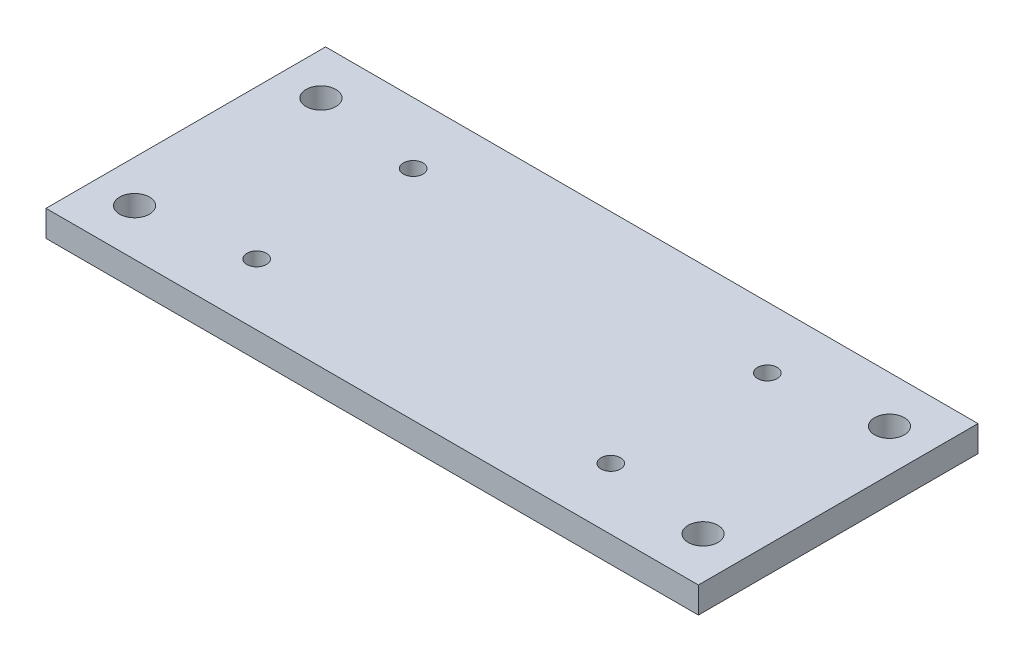
ISO-10303-21;
HEADER;
FILE_DESCRIPTION(('STEP AP214'),'2;1');
FILE_NAME('part.step','',(''),(''),'','','');
FILE_SCHEMA(('AUTOMOTIVE_DESIGN { 1 0 10303 214 1 1 1 1 }'));
ENDSEC;
DATA;
#1=APPLICATION_CONTEXT('core data for automotive mechanical design processes');
#2=APPLICATION_PROTOCOL_DEFINITION('international standard','automotive_design',2000,#1);
#3=PRODUCT_CONTEXT('',#1,'mechanical');
#4=PRODUCT('Part','Part','',(#3));
#5=PRODUCT_RELATED_PRODUCT_CATEGORY('part','',(#4));
#6=PRODUCT_DEFINITION_FORMATION('','',#4);
#7=PRODUCT_DEFINITION_CONTEXT('part definition',#1,'design');
#8=PRODUCT_DEFINITION('design','',#6,#7);
#9=PRODUCT_DEFINITION_SHAPE('','',#8);
#10=(LENGTH_UNIT() NAMED_UNIT(*) SI_UNIT(.MILLI.,.METRE.));
#11=(NAMED_UNIT(*) PLANE_ANGLE_UNIT() SI_UNIT($,.RADIAN.));
#12=(NAMED_UNIT(*) SI_UNIT($,.STERADIAN.) SOLID_ANGLE_UNIT());
#13=UNCERTAINTY_MEASURE_WITH_UNIT(LENGTH_MEASURE(1.E-05),#10,'distance_accuracy_value','');
#14=(GEOMETRIC_REPRESENTATION_CONTEXT(3) GLOBAL_UNCERTAINTY_ASSIGNED_CONTEXT((#13)) GLOBAL_UNIT_ASSIGNED_CONTEXT((#10,
#11,#12)) REPRESENTATION_CONTEXT('',''));
#15=CARTESIAN_POINT('',(0.,0.,0.));
#16=DIRECTION('',(0.,0.,1.));
#17=DIRECTION('',(1.,0.,0.));
#18=AXIS2_PLACEMENT_3D('',#15,#16,#17);
#19=CARTESIAN_POINT('',(0.,7.,0.));
#20=DIRECTION('',(1.,0.,0.));
#21=DIRECTION('',(0.,0.,-1.));
#22=AXIS2_PLACEMENT_3D('',#19,#20,#21);
#23=PLANE('',#22);
#24=DIRECTION('',(0.,0.,1.));
#25=VECTOR('',#24,1.);
#26=CARTESIAN_POINT('',(0.,0.,0.));
#27=LINE('',#26,#25);
#28=CARTESIAN_POINT('',(0.,0.,-75.));
#29=VERTEX_POINT('',#28);
#30=CARTESIAN_POINT('',(0.,0.,0.));
#31=VERTEX_POINT('',#30);
#32=EDGE_CURVE('E102',#29,#31,#27,.T.);
#33=ORIENTED_EDGE('',*,*,#32,.T.);
#34=DIRECTION('',(0.,-1.,0.));
#35=VECTOR('',#34,1.);
#36=CARTESIAN_POINT('',(0.,7.,0.));
#37=LINE('',#36,#35);
#38=CARTESIAN_POINT('',(0.,7.,0.));
#39=VERTEX_POINT('',#38);
#40=EDGE_CURVE('E11',#39,#31,#37,.T.);
#41=ORIENTED_EDGE('',*,*,#40,.F.);
#42=DIRECTION('',(0.,0.,1.));
#43=VECTOR('',#42,1.);
#44=CARTESIAN_POINT('',(0.,7.,0.));
#45=LINE('',#44,#43);
#46=CARTESIAN_POINT('',(0.,7.,-75.));
#47=VERTEX_POINT('',#46);
#48=EDGE_CURVE('E90',#47,#39,#45,.T.);
#49=ORIENTED_EDGE('',*,*,#48,.F.);
#50=DIRECTION('',(0.,-1.,0.));
#51=VECTOR('',#50,1.);
#52=CARTESIAN_POINT('',(0.,7.,-75.));
#53=LINE('',#52,#51);
#54=EDGE_CURVE('E98',#47,#29,#53,.T.);
#55=ORIENTED_EDGE('',*,*,#54,.T.);
#56=EDGE_LOOP('',(#33,#41,#49,#55));
#57=FACE_BOUND('',#56,.T.);
#58=ADVANCED_FACE('F39',(#57),#23,.F.);
#59=CARTESIAN_POINT('',(0.,7.,0.));
#60=DIRECTION('',(0.,0.,-1.));
#61=DIRECTION('',(-1.,0.,0.));
#62=AXIS2_PLACEMENT_3D('',#59,#60,#61);
#63=PLANE('',#62);
#64=DIRECTION('',(1.,0.,0.));
#65=VECTOR('',#64,1.);
#66=CARTESIAN_POINT('',(0.,0.,0.));
#67=LINE('',#66,#65);
#68=CARTESIAN_POINT('',(175.,0.,0.));
#69=VERTEX_POINT('',#68);
#70=EDGE_CURVE('E94',#31,#69,#67,.T.);
#71=ORIENTED_EDGE('',*,*,#70,.T.);
#72=DIRECTION('',(0.,-1.,0.));
#73=VECTOR('',#72,1.);
#74=CARTESIAN_POINT('',(175.,7.,0.));
#75=LINE('',#74,#73);
#76=CARTESIAN_POINT('',(175.,7.,0.));
#77=VERTEX_POINT('',#76);
#78=EDGE_CURVE('E47',#77,#69,#75,.T.);
#79=ORIENTED_EDGE('',*,*,#78,.F.);
#80=DIRECTION('',(1.,0.,0.));
#81=VECTOR('',#80,1.);
#82=CARTESIAN_POINT('',(0.,7.,0.));
#83=LINE('',#82,#81);
#84=EDGE_CURVE('E85',#39,#77,#83,.T.);
#85=ORIENTED_EDGE('',*,*,#84,.F.);
#86=ORIENTED_EDGE('',*,*,#40,.T.);
#87=EDGE_LOOP('',(#71,#79,#85,#86));
#88=FACE_BOUND('',#87,.T.);
#89=ADVANCED_FACE('F93',(#88),#63,.F.);
#90=CARTESIAN_POINT('',(175.,7.,0.));
#91=DIRECTION('',(-1.,0.,0.));
#92=DIRECTION('',(0.,0.,1.));
#93=AXIS2_PLACEMENT_3D('',#90,#91,#92);
#94=PLANE('',#93);
#95=DIRECTION('',(0.,0.,-1.));
#96=VECTOR('',#95,1.);
#97=CARTESIAN_POINT('',(175.,0.,0.));
#98=LINE('',#97,#96);
#99=CARTESIAN_POINT('',(175.,0.,-75.));
#100=VERTEX_POINT('',#99);
#101=EDGE_CURVE('E72',#69,#100,#98,.T.);
#102=ORIENTED_EDGE('',*,*,#101,.T.);
#103=DIRECTION('',(0.,-1.,0.));
#104=VECTOR('',#103,1.);
#105=CARTESIAN_POINT('',(175.,7.,-75.));
#106=LINE('',#105,#104);
#107=CARTESIAN_POINT('',(175.,7.,-75.));
#108=VERTEX_POINT('',#107);
#109=EDGE_CURVE('E95',#108,#100,#106,.T.);
#110=ORIENTED_EDGE('',*,*,#109,.F.);
#111=DIRECTION('',(0.,0.,-1.));
#112=VECTOR('',#111,1.);
#113=CARTESIAN_POINT('',(175.,7.,0.));
#114=LINE('',#113,#112);
#115=EDGE_CURVE('E88',#77,#108,#114,.T.);
#116=ORIENTED_EDGE('',*,*,#115,.F.);
#117=ORIENTED_EDGE('',*,*,#78,.T.);
#118=EDGE_LOOP('',(#102,#110,#116,#117));
#119=FACE_BOUND('',#118,.T.);
#120=ADVANCED_FACE('F96',(#119),#94,.F.);
#121=CARTESIAN_POINT('',(0.,7.,-75.));
#122=DIRECTION('',(0.,0.,1.));
#123=DIRECTION('',(1.,0.,0.));
#124=AXIS2_PLACEMENT_3D('',#121,#122,#123);
#125=PLANE('',#124);
#126=DIRECTION('',(-1.,0.,0.));
#127=VECTOR('',#126,1.);
#128=CARTESIAN_POINT('',(0.,0.,-75.));
#129=LINE('',#128,#127);
#130=EDGE_CURVE('E78',#100,#29,#129,.T.);
#131=ORIENTED_EDGE('',*,*,#130,.T.);
#132=ORIENTED_EDGE('',*,*,#54,.F.);
#133=DIRECTION('',(-1.,0.,0.));
#134=VECTOR('',#133,1.);
#135=CARTESIAN_POINT('',(0.,7.,-75.));
#136=LINE('',#135,#134);
#137=EDGE_CURVE('E55',#108,#47,#136,.T.);
#138=ORIENTED_EDGE('',*,*,#137,.F.);
#139=ORIENTED_EDGE('',*,*,#109,.T.);
#140=EDGE_LOOP('',(#131,#132,#138,#139));
#141=FACE_BOUND('',#140,.T.);
#142=ADVANCED_FACE('F110',(#141),#125,.F.);
#143=CARTESIAN_POINT('',(0.,7.,0.));
#144=DIRECTION('',(0.,-1.,0.));
#145=DIRECTION('',(0.,0.,-1.));
#146=AXIS2_PLACEMENT_3D('',#143,#144,#145);
#147=PLANE('',#146);
#148=CARTESIAN_POINT('',(11.25,7.,-12.5));
#149=DIRECTION('',(0.,1.,0.));
#150=DIRECTION('',(0.,0.,1.));
#151=AXIS2_PLACEMENT_3D('',#148,#149,#150);
#152=CIRCLE('',#151,4.00000000000001);
#153=CARTESIAN_POINT('',(11.25,7.,-8.49999999999999));
#154=VERTEX_POINT('',#153);
#155=EDGE_CURVE('E119',#154,#154,#152,.T.);
#156=ORIENTED_EDGE('',*,*,#155,.F.);
#157=EDGE_LOOP('',(#156));
#158=FACE_BOUND('',#157,.T.);
#159=CARTESIAN_POINT('',(40.,7.,-16.5000000000001));
#160=DIRECTION('',(0.,1.,0.));
#161=DIRECTION('',(0.,0.,1.));
#162=AXIS2_PLACEMENT_3D('',#159,#160,#161);
#163=CIRCLE('',#162,2.625);
#164=CARTESIAN_POINT('',(40.,7.,-13.8750000000001));
#165=VERTEX_POINT('',#164);
#166=EDGE_CURVE('E138',#165,#165,#163,.T.);
#167=ORIENTED_EDGE('',*,*,#166,.F.);
#168=EDGE_LOOP('',(#167));
#169=FACE_BOUND('',#168,.T.);
#170=CARTESIAN_POINT('',(163.75,7.,-12.5));
#171=DIRECTION('',(0.,1.,0.));
#172=DIRECTION('',(0.,0.,-1.));
#173=AXIS2_PLACEMENT_3D('',#170,#171,#172);
#174=CIRCLE('',#173,3.99999999999999);
#175=CARTESIAN_POINT('',(163.75,7.,-16.5));
#176=VERTEX_POINT('',#175);
#177=EDGE_CURVE('E132',#176,#176,#174,.T.);
#178=ORIENTED_EDGE('',*,*,#177,.F.);
#179=EDGE_LOOP('',(#178));
#180=FACE_BOUND('',#179,.T.);
#181=CARTESIAN_POINT('',(163.75,7.,-62.5));
#182=DIRECTION('',(0.,1.,0.));
#183=DIRECTION('',(0.,0.,-1.));
#184=AXIS2_PLACEMENT_3D('',#181,#182,#183);
#185=CIRCLE('',#184,3.99999999999999);
#186=CARTESIAN_POINT('',(163.75,7.,-66.5));
#187=VERTEX_POINT('',#186);
#188=EDGE_CURVE('E125',#187,#187,#185,.T.);
#189=ORIENTED_EDGE('',*,*,#188,.F.);
#190=EDGE_LOOP('',(#189));
#191=FACE_BOUND('',#190,.T.);
#192=CARTESIAN_POINT('',(135.,7.,-58.5));
#193=DIRECTION('',(0.,1.,0.));
#194=DIRECTION('',(0.,0.,-1.));
#195=AXIS2_PLACEMENT_3D('',#192,#193,#194);
#196=CIRCLE('',#195,2.625);
#197=CARTESIAN_POINT('',(135.,7.,-61.125));
#198=VERTEX_POINT('',#197);
#199=EDGE_CURVE('E150',#198,#198,#196,.T.);
#200=ORIENTED_EDGE('',*,*,#199,.F.);
#201=EDGE_LOOP('',(#200));
#202=FACE_BOUND('',#201,.T.);
#203=CARTESIAN_POINT('',(135.,7.,-16.5));
#204=DIRECTION('',(0.,1.,0.));
#205=DIRECTION('',(0.,0.,-1.));
#206=AXIS2_PLACEMENT_3D('',#203,#204,#205);
#207=CIRCLE('',#206,2.625);
#208=CARTESIAN_POINT('',(135.,7.,-19.125));
#209=VERTEX_POINT('',#208);
#210=EDGE_CURVE('E149',#209,#209,#207,.T.);
#211=ORIENTED_EDGE('',*,*,#210,.F.);
#212=EDGE_LOOP('',(#211));
#213=FACE_BOUND('',#212,.T.);
#214=CARTESIAN_POINT('',(40.,7.,-58.5));
#215=DIRECTION('',(0.,1.,0.));
#216=DIRECTION('',(0.,0.,1.));
#217=AXIS2_PLACEMENT_3D('',#214,#215,#216);
#218=CIRCLE('',#217,2.625);
#219=CARTESIAN_POINT('',(40.,7.,-55.875));
#220=VERTEX_POINT('',#219);
#221=EDGE_CURVE('E126',#220,#220,#218,.T.);
#222=ORIENTED_EDGE('',*,*,#221,.F.);
#223=EDGE_LOOP('',(#222));
#224=FACE_BOUND('',#223,.T.);
#225=CARTESIAN_POINT('',(11.25,7.,-62.5));
#226=DIRECTION('',(0.,1.,0.));
#227=DIRECTION('',(0.,0.,1.));
#228=AXIS2_PLACEMENT_3D('',#225,#226,#227);
#229=CIRCLE('',#228,4.00000000000001);
#230=CARTESIAN_POINT('',(11.25,7.,-58.5));
#231=VERTEX_POINT('',#230);
#232=EDGE_CURVE('E116',#231,#231,#229,.T.);
#233=ORIENTED_EDGE('',*,*,#232,.F.);
#234=EDGE_LOOP('',(#233));
#235=FACE_BOUND('',#234,.T.);
#236=ORIENTED_EDGE('',*,*,#48,.T.);
#237=ORIENTED_EDGE('',*,*,#84,.T.);
#238=ORIENTED_EDGE('',*,*,#115,.T.);
#239=ORIENTED_EDGE('',*,*,#137,.T.);
#240=EDGE_LOOP('',(#236,#237,#238,#239));
#241=FACE_BOUND('',#240,.T.);
#242=ADVANCED_FACE('F86',(#158,#169,#180,#191,#202,#213,#224,#235,#241),#147,.F.);
#243=CARTESIAN_POINT('',(0.,0.,0.));
#244=DIRECTION('',(0.,-1.,0.));
#245=DIRECTION('',(0.,0.,-1.));
#246=AXIS2_PLACEMENT_3D('',#243,#244,#245);
#247=PLANE('',#246);
#248=CARTESIAN_POINT('',(11.25,0.,-12.5));
#249=DIRECTION('',(0.,1.,0.));
#250=DIRECTION('',(0.,0.,1.));
#251=AXIS2_PLACEMENT_3D('',#248,#249,#250);
#252=CIRCLE('',#251,4.00000000000001);
#253=CARTESIAN_POINT('',(11.25,0.,-8.49999999999999));
#254=VERTEX_POINT('',#253);
#255=EDGE_CURVE('E141',#254,#254,#252,.T.);
#256=ORIENTED_EDGE('',*,*,#255,.T.);
#257=EDGE_LOOP('',(#256));
#258=FACE_BOUND('',#257,.T.);
#259=CARTESIAN_POINT('',(40.,0.,-16.5000000000001));
#260=DIRECTION('',(0.,1.,0.));
#261=DIRECTION('',(0.,0.,1.));
#262=AXIS2_PLACEMENT_3D('',#259,#260,#261);
#263=CIRCLE('',#262,2.625);
#264=CARTESIAN_POINT('',(40.,0.,-13.8750000000001));
#265=VERTEX_POINT('',#264);
#266=EDGE_CURVE('E135',#265,#265,#263,.T.);
#267=ORIENTED_EDGE('',*,*,#266,.T.);
#268=EDGE_LOOP('',(#267));
#269=FACE_BOUND('',#268,.T.);
#270=CARTESIAN_POINT('',(163.75,0.,-12.5));
#271=DIRECTION('',(0.,1.,0.));
#272=DIRECTION('',(0.,0.,-1.));
#273=AXIS2_PLACEMENT_3D('',#270,#271,#272);
#274=CIRCLE('',#273,3.99999999999999);
#275=CARTESIAN_POINT('',(163.75,0.,-16.5));
#276=VERTEX_POINT('',#275);
#277=EDGE_CURVE('E129',#276,#276,#274,.T.);
#278=ORIENTED_EDGE('',*,*,#277,.T.);
#279=EDGE_LOOP('',(#278));
#280=FACE_BOUND('',#279,.T.);
#281=CARTESIAN_POINT('',(163.75,0.,-62.5));
#282=DIRECTION('',(0.,1.,0.));
#283=DIRECTION('',(0.,0.,-1.));
#284=AXIS2_PLACEMENT_3D('',#281,#282,#283);
#285=CIRCLE('',#284,3.99999999999999);
#286=CARTESIAN_POINT('',(163.75,0.,-66.5));
#287=VERTEX_POINT('',#286);
#288=EDGE_CURVE('E122',#287,#287,#285,.T.);
#289=ORIENTED_EDGE('',*,*,#288,.T.);
#290=EDGE_LOOP('',(#289));
#291=FACE_BOUND('',#290,.T.);
#292=CARTESIAN_POINT('',(135.,0.,-58.5));
#293=DIRECTION('',(0.,1.,0.));
#294=DIRECTION('',(0.,0.,-1.));
#295=AXIS2_PLACEMENT_3D('',#292,#293,#294);
#296=CIRCLE('',#295,2.625);
#297=CARTESIAN_POINT('',(135.,0.,-61.125));
#298=VERTEX_POINT('',#297);
#299=EDGE_CURVE('E158',#298,#298,#296,.T.);
#300=ORIENTED_EDGE('',*,*,#299,.T.);
#301=EDGE_LOOP('',(#300));
#302=FACE_BOUND('',#301,.T.);
#303=CARTESIAN_POINT('',(135.,0.,-16.5));
#304=DIRECTION('',(0.,1.,0.));
#305=DIRECTION('',(0.,0.,-1.));
#306=AXIS2_PLACEMENT_3D('',#303,#304,#305);
#307=CIRCLE('',#306,2.625);
#308=CARTESIAN_POINT('',(135.,0.,-19.125));
#309=VERTEX_POINT('',#308);
#310=EDGE_CURVE('E146',#309,#309,#307,.T.);
#311=ORIENTED_EDGE('',*,*,#310,.T.);
#312=EDGE_LOOP('',(#311));
#313=FACE_BOUND('',#312,.T.);
#314=CARTESIAN_POINT('',(40.,0.,-58.5));
#315=DIRECTION('',(0.,1.,0.));
#316=DIRECTION('',(0.,0.,1.));
#317=AXIS2_PLACEMENT_3D('',#314,#315,#316);
#318=CIRCLE('',#317,2.625);
#319=CARTESIAN_POINT('',(40.,0.,-55.875));
#320=VERTEX_POINT('',#319);
#321=EDGE_CURVE('E153',#320,#320,#318,.T.);
#322=ORIENTED_EDGE('',*,*,#321,.T.);
#323=EDGE_LOOP('',(#322));
#324=FACE_BOUND('',#323,.T.);
#325=CARTESIAN_POINT('',(11.25,0.,-62.5));
#326=DIRECTION('',(0.,1.,0.));
#327=DIRECTION('',(0.,0.,1.));
#328=AXIS2_PLACEMENT_3D('',#325,#326,#327);
#329=CIRCLE('',#328,4.00000000000001);
#330=CARTESIAN_POINT('',(11.25,0.,-58.5));
#331=VERTEX_POINT('',#330);
#332=EDGE_CURVE('E105',#331,#331,#329,.T.);
#333=ORIENTED_EDGE('',*,*,#332,.T.);
#334=EDGE_LOOP('',(#333));
#335=FACE_BOUND('',#334,.T.);
#336=ORIENTED_EDGE('',*,*,#32,.F.);
#337=ORIENTED_EDGE('',*,*,#130,.F.);
#338=ORIENTED_EDGE('',*,*,#101,.F.);
#339=ORIENTED_EDGE('',*,*,#70,.F.);
#340=EDGE_LOOP('',(#336,#337,#338,#339));
#341=FACE_BOUND('',#340,.T.);
#342=ADVANCED_FACE('F113',(#258,#269,#280,#291,#302,#313,#324,#335,#341),#247,.T.);
#343=CARTESIAN_POINT('',(11.25,0.,-62.5));
#344=DIRECTION('',(0.,1.,0.));
#345=DIRECTION('',(0.,0.,1.));
#346=AXIS2_PLACEMENT_3D('',#343,#344,#345);
#347=CYLINDRICAL_SURFACE('',#346,4.00000000000001);
#348=ORIENTED_EDGE('',*,*,#332,.F.);
#349=EDGE_LOOP('',(#348));
#350=FACE_BOUND('',#349,.T.);
#351=ORIENTED_EDGE('',*,*,#232,.T.);
#352=EDGE_LOOP('',(#351));
#353=FACE_BOUND('',#352,.T.);
#354=ADVANCED_FACE('F176',(#350,#353),#347,.F.);
#355=CARTESIAN_POINT('',(40.,0.,-58.5));
#356=DIRECTION('',(0.,1.,0.));
#357=DIRECTION('',(0.,0.,1.));
#358=AXIS2_PLACEMENT_3D('',#355,#356,#357);
#359=CYLINDRICAL_SURFACE('',#358,2.625);
#360=ORIENTED_EDGE('',*,*,#321,.F.);
#361=EDGE_LOOP('',(#360));
#362=FACE_BOUND('',#361,.T.);
#363=ORIENTED_EDGE('',*,*,#221,.T.);
#364=EDGE_LOOP('',(#363));
#365=FACE_BOUND('',#364,.T.);
#366=ADVANCED_FACE('F178',(#362,#365),#359,.F.);
#367=CARTESIAN_POINT('',(135.,0.,-16.5));
#368=DIRECTION('',(0.,1.,0.));
#369=DIRECTION('',(0.,0.,1.));
#370=AXIS2_PLACEMENT_3D('',#367,#368,#369);
#371=CYLINDRICAL_SURFACE('',#370,2.625);
#372=ORIENTED_EDGE('',*,*,#310,.F.);
#373=EDGE_LOOP('',(#372));
#374=FACE_BOUND('',#373,.T.);
#375=ORIENTED_EDGE('',*,*,#210,.T.);
#376=EDGE_LOOP('',(#375));
#377=FACE_BOUND('',#376,.T.);
#378=ADVANCED_FACE('F185',(#374,#377),#371,.F.);
#379=CARTESIAN_POINT('',(135.,0.,-58.5));
#380=DIRECTION('',(0.,1.,0.));
#381=DIRECTION('',(0.,0.,1.));
#382=AXIS2_PLACEMENT_3D('',#379,#380,#381);
#383=CYLINDRICAL_SURFACE('',#382,2.625);
#384=ORIENTED_EDGE('',*,*,#299,.F.);
#385=EDGE_LOOP('',(#384));
#386=FACE_BOUND('',#385,.T.);
#387=ORIENTED_EDGE('',*,*,#199,.T.);
#388=EDGE_LOOP('',(#387));
#389=FACE_BOUND('',#388,.T.);
#390=ADVANCED_FACE('F164',(#386,#389),#383,.F.);
#391=CARTESIAN_POINT('',(163.75,0.,-62.5));
#392=DIRECTION('',(0.,1.,0.));
#393=DIRECTION('',(0.,0.,1.));
#394=AXIS2_PLACEMENT_3D('',#391,#392,#393);
#395=CYLINDRICAL_SURFACE('',#394,3.99999999999999);
#396=ORIENTED_EDGE('',*,*,#288,.F.);
#397=EDGE_LOOP('',(#396));
#398=FACE_BOUND('',#397,.T.);
#399=ORIENTED_EDGE('',*,*,#188,.T.);
#400=EDGE_LOOP('',(#399));
#401=FACE_BOUND('',#400,.T.);
#402=ADVANCED_FACE('F245',(#398,#401),#395,.F.);
#403=CARTESIAN_POINT('',(163.75,0.,-12.5));
#404=DIRECTION('',(0.,1.,0.));
#405=DIRECTION('',(0.,0.,1.));
#406=AXIS2_PLACEMENT_3D('',#403,#404,#405);
#407=CYLINDRICAL_SURFACE('',#406,3.99999999999999);
#408=ORIENTED_EDGE('',*,*,#277,.F.);
#409=EDGE_LOOP('',(#408));
#410=FACE_BOUND('',#409,.T.);
#411=ORIENTED_EDGE('',*,*,#177,.T.);
#412=EDGE_LOOP('',(#411));
#413=FACE_BOUND('',#412,.T.);
#414=ADVANCED_FACE('F255',(#410,#413),#407,.F.);
#415=CARTESIAN_POINT('',(40.,0.,-16.5000000000001));
#416=DIRECTION('',(0.,1.,0.));
#417=DIRECTION('',(0.,0.,1.));
#418=AXIS2_PLACEMENT_3D('',#415,#416,#417);
#419=CYLINDRICAL_SURFACE('',#418,2.625);
#420=ORIENTED_EDGE('',*,*,#266,.F.);
#421=EDGE_LOOP('',(#420));
#422=FACE_BOUND('',#421,.T.);
#423=ORIENTED_EDGE('',*,*,#166,.T.);
#424=EDGE_LOOP('',(#423));
#425=FACE_BOUND('',#424,.T.);
#426=ADVANCED_FACE('F264',(#422,#425),#419,.F.);
#427=CARTESIAN_POINT('',(11.25,0.,-12.5));
#428=DIRECTION('',(0.,1.,0.));
#429=DIRECTION('',(0.,0.,1.));
#430=AXIS2_PLACEMENT_3D('',#427,#428,#429);
#431=CYLINDRICAL_SURFACE('',#430,4.00000000000001);
#432=ORIENTED_EDGE('',*,*,#255,.F.);
#433=EDGE_LOOP('',(#432));
#434=FACE_BOUND('',#433,.T.);
#435=ORIENTED_EDGE('',*,*,#155,.T.);
#436=EDGE_LOOP('',(#435));
#437=FACE_BOUND('',#436,.T.);
#438=ADVANCED_FACE('F274',(#434,#437),#431,.F.);
#439=CLOSED_SHELL('',(#58,#89,#120,#142,#242,#342,#354,#366,#378,#390,#402,#414,#426,#438));
#440=MANIFOLD_SOLID_BREP('B2',#439);
#441=ADVANCED_BREP_SHAPE_REPRESENTATION('',(#18,#440),#14);
#442=SHAPE_DEFINITION_REPRESENTATION(#9,#441);
ENDSEC;
END-ISO-10303-21;
